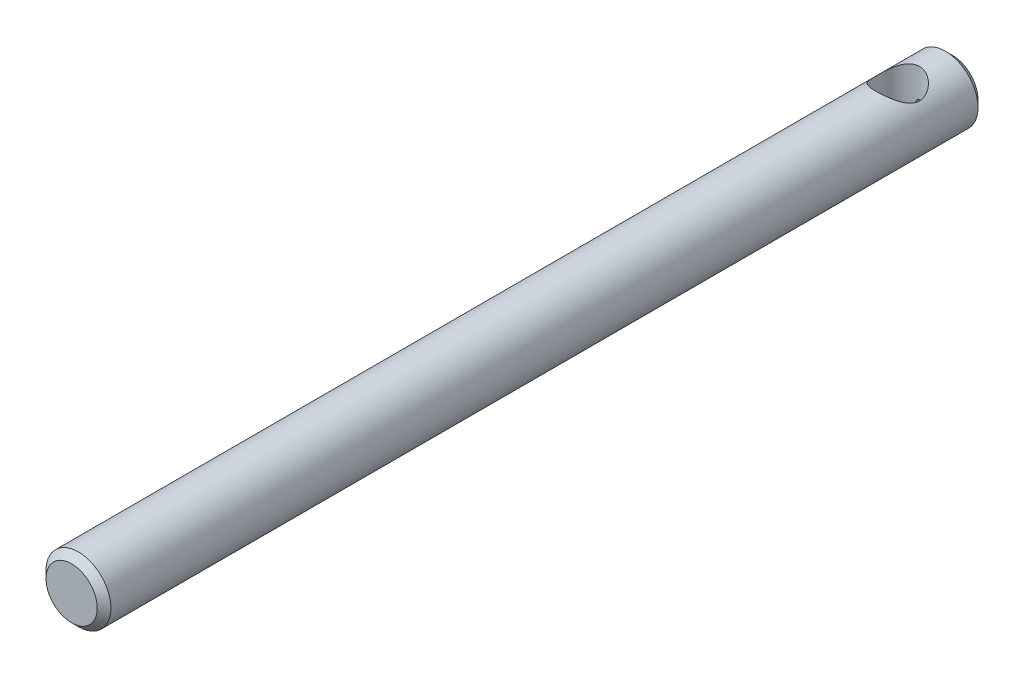
ISO-10303-21;
HEADER;
FILE_DESCRIPTION(('STEP AP214'),'2;1');
FILE_NAME('part.step','',(''),(''),'','','');
FILE_SCHEMA(('AUTOMOTIVE_DESIGN { 1 0 10303 214 1 1 1 1 }'));
ENDSEC;
DATA;
#1=APPLICATION_CONTEXT('core data for automotive mechanical design processes');
#2=APPLICATION_PROTOCOL_DEFINITION('international standard','automotive_design',2000,#1);
#3=PRODUCT_CONTEXT('',#1,'mechanical');
#4=PRODUCT('Part','Part','',(#3));
#5=PRODUCT_RELATED_PRODUCT_CATEGORY('part','',(#4));
#6=PRODUCT_DEFINITION_FORMATION('','',#4);
#7=PRODUCT_DEFINITION_CONTEXT('part definition',#1,'design');
#8=PRODUCT_DEFINITION('design','',#6,#7);
#9=PRODUCT_DEFINITION_SHAPE('','',#8);
#10=(LENGTH_UNIT() NAMED_UNIT(*) SI_UNIT(.MILLI.,.METRE.));
#11=(NAMED_UNIT(*) PLANE_ANGLE_UNIT() SI_UNIT($,.RADIAN.));
#12=(NAMED_UNIT(*) SI_UNIT($,.STERADIAN.) SOLID_ANGLE_UNIT());
#13=UNCERTAINTY_MEASURE_WITH_UNIT(LENGTH_MEASURE(1.E-05),#10,'distance_accuracy_value','');
#14=(GEOMETRIC_REPRESENTATION_CONTEXT(3) GLOBAL_UNCERTAINTY_ASSIGNED_CONTEXT((#13)) GLOBAL_UNIT_ASSIGNED_CONTEXT((#10,
#11,#12)) REPRESENTATION_CONTEXT('',''));
#15=CARTESIAN_POINT('',(0.,0.,0.));
#16=DIRECTION('',(0.,0.,1.));
#17=DIRECTION('',(1.,0.,0.));
#18=AXIS2_PLACEMENT_3D('',#15,#16,#17);
#19=CARTESIAN_POINT('',(9.02851192918774E-05,0.,121.000323623922));
#20=DIRECTION('',(0.,0.,-1.));
#21=DIRECTION('',(-1.,0.,0.));
#22=AXIS2_PLACEMENT_3D('',#19,#20,#21);
#23=PLANE('',#22);
#24=CARTESIAN_POINT('',(9.02851192916892E-05,0.,121.000323623922));
#25=DIRECTION('',(0.,0.,-1.));
#26=DIRECTION('',(-1.,0.,0.));
#27=AXIS2_PLACEMENT_3D('',#24,#25,#26);
#28=CIRCLE('',#27,3.75);
#29=CARTESIAN_POINT('',(-3.74990971488071,0.,121.000323623922));
#30=VERTEX_POINT('',#29);
#31=EDGE_CURVE('E9',#30,#30,#28,.F.);
#32=ORIENTED_EDGE('',*,*,#31,.T.);
#33=EDGE_LOOP('',(#32));
#34=FACE_BOUND('',#33,.T.);
#35=ADVANCED_FACE('F13',(#34),#23,.F.);
#36=CARTESIAN_POINT('',(9.02851192918774E-05,0.,-7.99967637607752));
#37=DIRECTION('',(0.,0.,-1.));
#38=DIRECTION('',(-1.,0.,0.));
#39=AXIS2_PLACEMENT_3D('',#36,#37,#38);
#40=CYLINDRICAL_SURFACE('',#39,4.75000000000001);
#41=CARTESIAN_POINT('',(9.02851192918774E-05,0.,120.000323623922));
#42=DIRECTION('',(0.,0.,-1.));
#43=DIRECTION('',(-1.,0.,0.));
#44=AXIS2_PLACEMENT_3D('',#41,#42,#43);
#45=CIRCLE('',#44,4.75000000000001);
#46=CARTESIAN_POINT('',(-4.74990971488072,0.,120.000323623922));
#47=VERTEX_POINT('',#46);
#48=EDGE_CURVE('E23',#47,#47,#45,.T.);
#49=ORIENTED_EDGE('',*,*,#48,.T.);
#50=EDGE_LOOP('',(#49));
#51=FACE_BOUND('',#50,.T.);
#52=CARTESIAN_POINT('',(9.02851192918774E-05,0.,-6.99967637607752));
#53=DIRECTION('',(0.,0.,1.));
#54=DIRECTION('',(1.,0.,0.));
#55=AXIS2_PLACEMENT_3D('',#52,#53,#54);
#56=CIRCLE('',#55,4.75000000000001);
#57=CARTESIAN_POINT('',(4.7500902851193,0.,-6.99967637607752));
#58=VERTEX_POINT('',#57);
#59=EDGE_CURVE('E30',#58,#58,#56,.T.);
#60=ORIENTED_EDGE('',*,*,#59,.T.);
#61=EDGE_LOOP('',(#60));
#62=FACE_BOUND('',#61,.T.);
#63=CARTESIAN_POINT('',(9.02851192932691E-05,-4.75000000000001,-3.17467637607752));
#64=CARTESIAN_POINT('',(0.159523559242158,-4.749999211952,-3.17467520210206));
#65=CARTESIAN_POINT('',(0.318960302784402,-4.74190338495527,-3.16260120587666));
#66=CARTESIAN_POINT('',(0.632738490097746,-4.71032455908102,-3.11505650051762));
#67=CARTESIAN_POINT('',(0.787077660661687,-4.68683479021578,-3.07957549734404));
#68=CARTESIAN_POINT('',(1.08567173449167,-4.62678353040751,-2.98739509817718));
#69=CARTESIAN_POINT('',(1.22997013682867,-4.59028324549489,-2.93079499645765));
#70=CARTESIAN_POINT('',(1.50643234848686,-4.50713889710792,-2.79879244895306));
#71=CARTESIAN_POINT('',(1.63859435592674,-4.46049333082322,-2.72338721734009));
#72=CARTESIAN_POINT('',(1.89972393961344,-4.35606566378104,-2.54893887313733));
#73=CARTESIAN_POINT('',(2.02746378167953,-4.29767380490287,-2.44843078013368));
#74=CARTESIAN_POINT('',(2.26543348465758,-4.17714675304667,-2.23014022595261));
#75=CARTESIAN_POINT('',(2.37563769541936,-4.11500625658128,-2.11233293575885));
#76=CARTESIAN_POINT('',(2.59329695211398,-3.98201923115985,-1.8410871244648));
#77=CARTESIAN_POINT('',(2.69753972413487,-3.91135622655066,-1.68496100416914));
#78=CARTESIAN_POINT('',(2.87819078591067,-3.78040838342273,-1.35342832264973));
#79=CARTESIAN_POINT('',(2.95464719541042,-3.72010569959833,-1.17805578449882));
#80=CARTESIAN_POINT('',(3.05819025467089,-3.63505890160726,-0.864237488175177));
#81=CARTESIAN_POINT('',(3.09316391185298,-3.60507428577889,-0.729828717145726));
#82=CARTESIAN_POINT('',(3.14532023822978,-3.5596705342505,-0.455301698493249));
#83=CARTESIAN_POINT('',(3.16253381858021,-3.54422609569885,-0.315193813526074));
#84=CARTESIAN_POINT('',(3.17808703884019,-3.53029276704611,-0.0324651157176194));
#85=CARTESIAN_POINT('',(3.17634813940645,-3.53187443302817,0.110163706802345));
#86=CARTESIAN_POINT('',(3.15393566336046,-3.55189525709392,0.392771423106469));
#87=CARTESIAN_POINT('',(3.13324604040797,-3.57034870116703,0.532747968563199));
#88=CARTESIAN_POINT('',(3.07564590349141,-3.62005530602343,0.799980106674125));
#89=CARTESIAN_POINT('',(3.03951005067753,-3.65069285254148,0.927524705505058));
#90=CARTESIAN_POINT('',(2.95277435532785,-3.72119236198158,1.17483413862681));
#91=CARTESIAN_POINT('',(2.90216974706534,-3.76105736342256,1.29459639358712));
#92=CARTESIAN_POINT('',(2.7761289041144,-3.85531840590746,1.54896641476868));
#93=CARTESIAN_POINT('',(2.69773308512173,-3.91101980105383,1.68161950145604));
#94=CARTESIAN_POINT('',(2.52342108076777,-4.02569455529003,1.93343430626161));
#95=CARTESIAN_POINT('',(2.42748325676911,-4.08467189210462,2.05257906405419));
#96=CARTESIAN_POINT('',(2.19642000339969,-4.21423522790872,2.30063028524261));
#97=CARTESIAN_POINT('',(2.05731066722869,-4.28455099643896,2.42600830864916));
#98=CARTESIAN_POINT('',(1.75653079691954,-4.41636796090386,2.6518912235589));
#99=CARTESIAN_POINT('',(1.5948813364133,-4.47787728269224,2.75241910775619));
#100=CARTESIAN_POINT('',(1.28564463734124,-4.57501369248633,2.90751416849579));
#101=CARTESIAN_POINT('',(1.14149287685756,-4.61335009150547,2.96722532162));
#102=CARTESIAN_POINT('',(0.843386465308846,-4.67701970125944,3.06529318383422));
#103=CARTESIAN_POINT('',(0.689440241994157,-4.70236392560248,3.10366798232764));
#104=CARTESIAN_POINT('',(0.375084826086689,-4.73782521946594,3.1571446896905));
#105=CARTESIAN_POINT('',(0.214650400178247,-4.74787547344105,3.17214448581729));
#106=CARTESIAN_POINT('',(-0.106828979534429,-4.75151468856562,3.17759036966522));
#107=CARTESIAN_POINT('',(-0.267873883393648,-4.74510496852045,3.16803842451994));
#108=CARTESIAN_POINT('',(-0.573853185577953,-4.71752224658637,3.12655964674889));
#109=CARTESIAN_POINT('',(-0.719116672692495,-4.69743647642483,3.09627976832538));
#110=CARTESIAN_POINT('',(-1.00201012973531,-4.64532012613918,3.01661755079842));
#111=CARTESIAN_POINT('',(-1.13963888084322,-4.61328764509262,2.96723217164209));
#112=CARTESIAN_POINT('',(-1.41255154854837,-4.53742110448774,2.84787791279913));
#113=CARTESIAN_POINT('',(-1.54720800294586,-4.49299795354843,2.77685859836752));
#114=CARTESIAN_POINT('',(-1.80313132638656,-4.39654739148957,2.61790733926099));
#115=CARTESIAN_POINT('',(-1.92439000476669,-4.34451537339169,2.5299651379384));
#116=CARTESIAN_POINT('',(-2.17038032744309,-4.22763553546742,2.32397328277039));
#117=CARTESIAN_POINT('',(-2.29262226184674,-4.1620629302639,2.20336129660345));
#118=CARTESIAN_POINT('',(-2.51624769765088,-4.03080183178884,1.94403564657291));
#119=CARTESIAN_POINT('',(-2.61761618483209,-3.96511328913999,1.80530906932388));
#120=CARTESIAN_POINT('',(-2.79046195891875,-3.84518858129252,1.52301454245801));
#121=CARTESIAN_POINT('',(-2.86368776855465,-3.79045623144052,1.3807336538721));
#122=CARTESIAN_POINT('',(-2.9887997924519,-3.69260969367759,1.08340219409397));
#123=CARTESIAN_POINT('',(-3.04072435688301,-3.64947467495308,0.928375180341632));
#124=CARTESIAN_POINT('',(-3.11320542231531,-3.58772145394521,0.637628617305611));
#125=CARTESIAN_POINT('',(-3.13776387372683,-3.5660608723218,0.503569005525376));
#126=CARTESIAN_POINT('',(-3.16939765693855,-3.53798273381451,0.231881429631234));
#127=CARTESIAN_POINT('',(-3.17649256806744,-3.531548106595,0.0942576366831156));
#128=CARTESIAN_POINT('',(-3.17273051584376,-3.53492719799126,-0.180634826070279));
#129=CARTESIAN_POINT('',(-3.16186019110862,-3.54475301007916,-0.317903155444917));
#130=CARTESIAN_POINT('',(-3.12289454000202,-3.57912150992849,-0.588140498755023));
#131=CARTESIAN_POINT('',(-3.09477618948109,-3.60368386833828,-0.72110351539677));
#132=CARTESIAN_POINT('',(-3.01331764295638,-3.6722439182131,-1.01397363602656));
#133=CARTESIAN_POINT('',(-2.95528647282194,-3.71965573890371,-1.17175960379719));
#134=CARTESIAN_POINT('',(-2.81709952797029,-3.82537408900602,-1.47333981552594));
#135=CARTESIAN_POINT('',(-2.73691260311399,-3.88369591990883,-1.61711397156006));
#136=CARTESIAN_POINT('',(-2.55487832198092,-4.00585681478387,-1.89187504908151));
#137=CARTESIAN_POINT('',(-2.4526585388334,-4.06977783459629,-2.02257702012106));
#138=CARTESIAN_POINT('',(-2.22875950283445,-4.19657773635319,-2.26689629211049));
#139=CARTESIAN_POINT('',(-2.10707422092758,-4.25945628873275,-2.38050827854991));
#140=CARTESIAN_POINT('',(-1.90129614987098,-4.35362786266907,-2.54419312911521));
#141=CARTESIAN_POINT('',(-1.82321620891763,-4.38698389120322,-2.60074380981563));
#142=CARTESIAN_POINT('',(-1.66140918884278,-4.45078321221234,-2.70696343033902));
#143=CARTESIAN_POINT('',(-1.57768470210049,-4.48122782648757,-2.75663549772936));
#144=CARTESIAN_POINT('',(-1.40506883584378,-4.53831230344027,-2.8484825138305));
#145=CARTESIAN_POINT('',(-1.31618196834517,-4.56495542032589,-2.89066388248807));
#146=CARTESIAN_POINT('',(-1.13384136679606,-4.6136338401226,-2.96693099632058));
#147=CARTESIAN_POINT('',(-1.04038917896523,-4.63567068995518,-3.00101945985767));
#148=CARTESIAN_POINT('',(-0.794122920593584,-4.68565064367691,-3.07778419214154));
#149=CARTESIAN_POINT('',(-0.638360227857761,-4.70958857412386,-3.11394630589047));
#150=CARTESIAN_POINT('',(-0.321699908452763,-4.74175724534122,-3.16238325014652));
#151=CARTESIAN_POINT('',(-0.160806578371704,-4.75000079528226,-3.17467756083));
#152=CARTESIAN_POINT('',(9.02851192932691E-05,-4.75000000000001,-3.17467637607752));
#153=B_SPLINE_CURVE_WITH_KNOTS('',3,(#63,#64,#65,#66,#67,#68,#69,#70,#71,#72,#73,#74,#75,#76,
#77,#78,#79,#80,#81,#82,#83,#84,#85,#86,#87,#88,#89,#90,#91,#92,#93,#94,#95,#96,#97,#98,#99,
#100,#101,#102,#103,#104,#105,#106,#107,#108,#109,#110,#111,#112,#113,#114,#115,#116,#117,#118,
#119,#120,#121,#122,#123,#124,#125,#126,#127,#128,#129,#130,#131,#132,#133,#134,#135,#136,#137,
#138,#139,#140,#141,#142,#143,#144,#145,#146,#147,#148,#149,#150,#151,#152),.UNSPECIFIED.,.T.,
.F.,(4,2,2,2,2,2,2,2,2,2,2,2,2,2,2,2,2,2,2,2,2,2,2,2,2,2,2,2,2,2,2,2,2,2,2,2,2,2,2,2,2,2,2,2,4),
(0.,0.477670324353115,0.955550860900732,1.4312123232046,1.9069442928089,2.42313825950044,
2.94008047950573,3.53906707979407,4.13701137033099,4.56158021920458,4.98540885918278,
5.41099451655657,5.83694086789796,6.2436531122531,6.65049947434567,7.1403321818873,
7.63077324109545,8.228063650625,8.82479932860172,9.30479598936381,9.78438507604036,
10.26606341294,10.7477031580314,11.1949397894877,11.6422476141891,12.1161870778625,
12.5904146973429,13.1397243978878,13.6894278458804,14.1949135991591,14.6994852531897,
15.1117000268718,15.523452433123,15.9355112120628,16.3481212431652,16.869348520834,
17.3913123860669,17.9229089335254,18.454670452504,18.7603505360058,19.0658911733362,
19.3711686680123,19.6763434761234,20.1587927160615,20.6408480297592),.UNSPECIFIED.);
#154=CARTESIAN_POINT('',(9.02851192932691E-05,-4.75000000000001,-3.17467637607752));
#155=VERTEX_POINT('',#154);
#156=EDGE_CURVE('E36',#155,#155,#153,.F.);
#157=ORIENTED_EDGE('',*,*,#156,.T.);
#158=EDGE_LOOP('',(#157));
#159=FACE_BOUND('',#158,.T.);
#160=CARTESIAN_POINT('',(9.02851192899962E-05,4.75000000000001,-3.17467637607752));
#161=CARTESIAN_POINT('',(-0.159342989003575,4.749999211952,-3.17467520210206));
#162=CARTESIAN_POINT('',(-0.318779732545819,4.74190338495527,-3.16260120587666));
#163=CARTESIAN_POINT('',(-0.632557919859163,4.71032455908102,-3.11505650051762));
#164=CARTESIAN_POINT('',(-0.786897090423105,4.68683479021578,-3.07957549734404));
#165=CARTESIAN_POINT('',(-1.08549116425309,4.62678353040751,-2.98739509817718));
#166=CARTESIAN_POINT('',(-1.22978956659008,4.59028324549489,-2.93079499645765));
#167=CARTESIAN_POINT('',(-1.50625177824828,4.50713889710792,-2.79879244895306));
#168=CARTESIAN_POINT('',(-1.63841378568815,4.46049333082322,-2.72338721734009));
#169=CARTESIAN_POINT('',(-1.89954336937486,4.35606566378104,-2.54893887313733));
#170=CARTESIAN_POINT('',(-2.02728321144095,4.29767380490287,-2.44843078013367));
#171=CARTESIAN_POINT('',(-2.26525291441899,4.17714675304667,-2.23014022595261));
#172=CARTESIAN_POINT('',(-2.37545712518077,4.11500625658128,-2.11233293575884));
#173=CARTESIAN_POINT('',(-2.5931163818754,3.98201923115984,-1.84108712446479));
#174=CARTESIAN_POINT('',(-2.69735915389629,3.91135622655066,-1.68496100416914));
#175=CARTESIAN_POINT('',(-2.87801021567209,3.78040838342273,-1.35342832264973));
#176=CARTESIAN_POINT('',(-2.95446662517184,3.72010569959833,-1.17805578449882));
#177=CARTESIAN_POINT('',(-3.05800968443231,3.63505890160726,-0.864237488175176));
#178=CARTESIAN_POINT('',(-3.0929833416144,3.60507428577888,-0.729828717145725));
#179=CARTESIAN_POINT('',(-3.14513966799119,3.5596705342505,-0.455301698493248));
#180=CARTESIAN_POINT('',(-3.16235324834162,3.54422609569885,-0.315193813526073));
#181=CARTESIAN_POINT('',(-3.17790646860161,3.53029276704611,-0.0324651157176186));
#182=CARTESIAN_POINT('',(-3.17616756916787,3.53187443302817,0.110163706802346));
#183=CARTESIAN_POINT('',(-3.15375509312187,3.55189525709392,0.392771423106469));
#184=CARTESIAN_POINT('',(-3.13306547016938,3.57034870116703,0.5327479685632));
#185=CARTESIAN_POINT('',(-3.07546533325283,3.62005530602343,0.799980106674125));
#186=CARTESIAN_POINT('',(-3.03932948043895,3.65069285254148,0.927524705505058));
#187=CARTESIAN_POINT('',(-2.95259378508926,3.72119236198158,1.17483413862681));
#188=CARTESIAN_POINT('',(-2.90198917682676,3.76105736342256,1.29459639358712));
#189=CARTESIAN_POINT('',(-2.77594833387582,3.85531840590746,1.54896641476868));
#190=CARTESIAN_POINT('',(-2.69755251488315,3.91101980105383,1.68161950145604));
#191=CARTESIAN_POINT('',(-2.52324051052919,4.02569455529003,1.93343430626161));
#192=CARTESIAN_POINT('',(-2.42730268653052,4.08467189210461,2.05257906405419));
#193=CARTESIAN_POINT('',(-2.19623943316111,4.21423522790872,2.30063028524261));
#194=CARTESIAN_POINT('',(-2.0571300969901,4.28455099643896,2.42600830864916));
#195=CARTESIAN_POINT('',(-1.75635022668096,4.41636796090385,2.6518912235589));
#196=CARTESIAN_POINT('',(-1.59470076617472,4.47787728269224,2.75241910775619));
#197=CARTESIAN_POINT('',(-1.28546406710265,4.57501369248633,2.90751416849579));
#198=CARTESIAN_POINT('',(-1.14131230661897,4.61335009150547,2.96722532162));
#199=CARTESIAN_POINT('',(-0.843205895070263,4.67701970125944,3.06529318383422));
#200=CARTESIAN_POINT('',(-0.689259671755574,4.70236392560248,3.10366798232764));
#201=CARTESIAN_POINT('',(-0.374904255848105,4.73782521946594,3.1571446896905));
#202=CARTESIAN_POINT('',(-0.214469829939662,4.74787547344105,3.17214448581729));
#203=CARTESIAN_POINT('',(0.107009549773013,4.75151468856562,3.17759036966522));
#204=CARTESIAN_POINT('',(0.268054453632232,4.74510496852045,3.16803842451994));
#205=CARTESIAN_POINT('',(0.574033755816537,4.71752224658637,3.12655964674889));
#206=CARTESIAN_POINT('',(0.719297242931079,4.69743647642483,3.09627976832538));
#207=CARTESIAN_POINT('',(1.0021906999739,4.64532012613918,3.01661755079842));
#208=CARTESIAN_POINT('',(1.13981945108181,4.61328764509262,2.96723217164209));
#209=CARTESIAN_POINT('',(1.41273211878696,4.53742110448774,2.84787791279913));
#210=CARTESIAN_POINT('',(1.54738857318445,4.49299795354843,2.77685859836752));
#211=CARTESIAN_POINT('',(1.80331189662514,4.39654739148957,2.61790733926099));
#212=CARTESIAN_POINT('',(1.92457057500528,4.34451537339169,2.5299651379384));
#213=CARTESIAN_POINT('',(2.17056089768168,4.22763553546743,2.32397328277039));
#214=CARTESIAN_POINT('',(2.29280283208533,4.1620629302639,2.20336129660345));
#215=CARTESIAN_POINT('',(2.51642826788946,4.03080183178884,1.94403564657291));
#216=CARTESIAN_POINT('',(2.61779675507067,3.96511328914,1.80530906932388));
#217=CARTESIAN_POINT('',(2.79064252915733,3.84518858129252,1.52301454245801));
#218=CARTESIAN_POINT('',(2.86386833879323,3.79045623144052,1.3807336538721));
#219=CARTESIAN_POINT('',(2.98898036269048,3.69260969367759,1.08340219409397));
#220=CARTESIAN_POINT('',(3.04090492712159,3.64947467495308,0.928375180341631));
#221=CARTESIAN_POINT('',(3.11338599255389,3.58772145394521,0.637628617305609));
#222=CARTESIAN_POINT('',(3.13794444396541,3.5660608723218,0.503569005525375));
#223=CARTESIAN_POINT('',(3.16957822717713,3.53798273381451,0.231881429631233));
#224=CARTESIAN_POINT('',(3.17667313830602,3.531548106595,0.0942576366831144));
#225=CARTESIAN_POINT('',(3.17291108608234,3.53492719799126,-0.180634826070281));
#226=CARTESIAN_POINT('',(3.1620407613472,3.54475301007916,-0.317903155444918));
#227=CARTESIAN_POINT('',(3.1230751102406,3.57912150992849,-0.588140498755025));
#228=CARTESIAN_POINT('',(3.09495675971967,3.60368386833828,-0.721103515396771));
#229=CARTESIAN_POINT('',(3.01349821319496,3.6722439182131,-1.01397363602656));
#230=CARTESIAN_POINT('',(2.95546704306052,3.71965573890371,-1.17175960379719));
#231=CARTESIAN_POINT('',(2.81728009820887,3.82537408900602,-1.47333981552595));
#232=CARTESIAN_POINT('',(2.73709317335258,3.88369591990883,-1.61711397156006));
#233=CARTESIAN_POINT('',(2.5550588922195,4.00585681478387,-1.89187504908151));
#234=CARTESIAN_POINT('',(2.45283910907198,4.06977783459629,-2.02257702012106));
#235=CARTESIAN_POINT('',(2.22894007307303,4.19657773635319,-2.26689629211049));
#236=CARTESIAN_POINT('',(2.10725479116616,4.25945628873275,-2.38050827854991));
#237=CARTESIAN_POINT('',(1.90147672010956,4.35362786266907,-2.54419312911521));
#238=CARTESIAN_POINT('',(1.82339677915621,4.38698389120322,-2.60074380981564));
#239=CARTESIAN_POINT('',(1.66158975908136,4.45078321221234,-2.70696343033902));
#240=CARTESIAN_POINT('',(1.57786527233907,4.48122782648757,-2.75663549772936));
#241=CARTESIAN_POINT('',(1.40524940608236,4.53831230344027,-2.8484825138305));
#242=CARTESIAN_POINT('',(1.31636253858375,4.56495542032589,-2.89066388248807));
#243=CARTESIAN_POINT('',(1.13402193703464,4.61363384012261,-2.96693099632058));
#244=CARTESIAN_POINT('',(1.04056974920381,4.63567068995518,-3.00101945985767));
#245=CARTESIAN_POINT('',(0.794303490832166,4.6856506436769,-3.07778419214154));
#246=CARTESIAN_POINT('',(0.638540798096343,4.70958857412386,-3.11394630589047));
#247=CARTESIAN_POINT('',(0.321880478691345,4.74175724534122,-3.16238325014652));
#248=CARTESIAN_POINT('',(0.160987148610287,4.75000079528226,-3.17467756083));
#249=CARTESIAN_POINT('',(9.02851192899962E-05,4.75000000000001,-3.17467637607752));
#250=B_SPLINE_CURVE_WITH_KNOTS('',3,(#160,#161,#162,#163,#164,#165,#166,#167,#168,#169,#170,
#171,#172,#173,#174,#175,#176,#177,#178,#179,#180,#181,#182,#183,#184,#185,#186,#187,#188,#189,
#190,#191,#192,#193,#194,#195,#196,#197,#198,#199,#200,#201,#202,#203,#204,#205,#206,#207,#208,
#209,#210,#211,#212,#213,#214,#215,#216,#217,#218,#219,#220,#221,#222,#223,#224,#225,#226,#227,
#228,#229,#230,#231,#232,#233,#234,#235,#236,#237,#238,#239,#240,#241,#242,#243,#244,#245,#246,
#247,#248,#249),.UNSPECIFIED.,.T.,.F.,(4,2,2,2,2,2,2,2,2,2,2,2,2,2,2,2,2,2,2,2,2,2,2,2,2,2,2,2,
2,2,2,2,2,2,2,2,2,2,2,2,2,2,2,2,4),(0.,0.477670324353115,0.955550860900732,1.43121232320461,
1.9069442928089,2.42313825950044,2.94008047950573,3.53906707979407,4.13701137033099,
4.56158021920458,4.98540885918278,5.41099451655657,5.83694086789796,6.2436531122531,
6.65049947434567,7.1403321818873,7.63077324109545,8.228063650625,8.82479932860172,
9.30479598936381,9.78438507604036,10.26606341294,10.7477031580315,11.1949397894877,
11.6422476141891,12.1161870778625,12.5904146973429,13.1397243978878,13.6894278458804,
14.1949135991591,14.6994852531897,15.1117000268718,15.523452433123,15.9355112120629,
16.3481212431652,16.869348520834,17.3913123860669,17.9229089335254,18.454670452504,
18.7603505360058,19.0658911733362,19.3711686680123,19.6763434761234,20.1587927160615,
20.6408480297592),.UNSPECIFIED.);
#251=CARTESIAN_POINT('',(9.02851192899962E-05,4.75000000000001,-3.17467637607752));
#252=VERTEX_POINT('',#251);
#253=EDGE_CURVE('E43',#252,#252,#250,.F.);
#254=ORIENTED_EDGE('',*,*,#253,.T.);
#255=EDGE_LOOP('',(#254));
#256=FACE_BOUND('',#255,.T.);
#257=ADVANCED_FACE('F48',(#51,#62,#159,#256),#40,.T.);
#258=CARTESIAN_POINT('',(9.02851192918774E-05,0.,-7.99967637607752));
#259=DIRECTION('',(0.,0.,1.));
#260=DIRECTION('',(1.,0.,0.));
#261=AXIS2_PLACEMENT_3D('',#258,#259,#260);
#262=PLANE('',#261);
#263=CARTESIAN_POINT('',(9.02851192922809E-05,0.,-7.99967637607752));
#264=DIRECTION('',(0.,0.,1.));
#265=DIRECTION('',(1.,0.,0.));
#266=AXIS2_PLACEMENT_3D('',#263,#264,#265);
#267=CIRCLE('',#266,3.75);
#268=CARTESIAN_POINT('',(3.7500902851193,0.,-7.99967637607752));
#269=VERTEX_POINT('',#268);
#270=EDGE_CURVE('E69',#269,#269,#267,.F.);
#271=ORIENTED_EDGE('',*,*,#270,.T.);
#272=EDGE_LOOP('',(#271));
#273=FACE_BOUND('',#272,.T.);
#274=CARTESIAN_POINT('',(9.02851192904166E-05,0.,-7.99967637607752));
#275=DIRECTION('',(0.,0.,1.));
#276=DIRECTION('',(1.,0.,0.));
#277=AXIS2_PLACEMENT_3D('',#274,#275,#276);
#278=CIRCLE('',#277,0.499999999999999);
#279=CARTESIAN_POINT('',(0.500090285119289,0.,-7.99967637607752));
#280=VERTEX_POINT('',#279);
#281=EDGE_CURVE('E18',#280,#280,#278,.F.);
#282=ORIENTED_EDGE('',*,*,#281,.F.);
#283=EDGE_LOOP('',(#282));
#284=FACE_BOUND('',#283,.T.);
#285=ADVANCED_FACE('F52',(#273,#284),#262,.F.);
#286=CARTESIAN_POINT('',(9.02851192918774E-05,-10.,0.000323623922480754));
#287=DIRECTION('',(0.,1.,0.));
#288=DIRECTION('',(1.,0.,0.));
#289=AXIS2_PLACEMENT_3D('',#286,#287,#288);
#290=CYLINDRICAL_SURFACE('',#289,3.175);
#291=CARTESIAN_POINT('',(0.50009028511929,0.,-3.13505912783208));
#292=CARTESIAN_POINT('',(0.500089145833202,0.027897747805815,-3.1350596117128));
#293=CARTESIAN_POINT('',(0.497747531507359,0.0558112720045634,-3.13543549918252));
#294=CARTESIAN_POINT('',(0.488446119696019,0.110856680252458,-3.13689726333182));
#295=CARTESIAN_POINT('',(0.481481924847439,0.137987794343761,-3.13798381603781));
#296=CARTESIAN_POINT('',(0.463149909841214,0.190663707890317,-3.14074086410108));
#297=CARTESIAN_POINT('',(0.451785600226606,0.216209753156556,-3.14241089383949));
#298=CARTESIAN_POINT('',(0.424984427778004,0.26502919216806,-3.146146173875));
#299=CARTESIAN_POINT('',(0.409548080818352,0.288302873281044,-3.14821137410003));
#300=CARTESIAN_POINT('',(0.374895815840152,0.332125270916456,-3.15252464207061));
#301=CARTESIAN_POINT('',(0.355651059123807,0.352651057147097,-3.15477402317795));
#302=CARTESIAN_POINT('',(0.313990560833302,0.39019610271537,-3.15919050669613));
#303=CARTESIAN_POINT('',(0.291574639196031,0.40721516280137,-3.16135760442594));
#304=CARTESIAN_POINT('',(0.244060464438045,0.437348904555735,-3.16537916082933));
#305=CARTESIAN_POINT('',(0.218948597539818,0.450442369693115,-3.16723189792344));
#306=CARTESIAN_POINT('',(0.166847962246803,0.472216997906316,-3.17040140252456));
#307=CARTESIAN_POINT('',(0.139859303069834,0.480898417492307,-3.1717182011894));
#308=CARTESIAN_POINT('',(0.0850076949462363,0.493532731277547,-3.17365819311014));
#309=CARTESIAN_POINT('',(0.0571538070275657,0.497524083917402,-3.17428702469853));
#310=CARTESIAN_POINT('',(0.00116504316753877,0.50078445577113,-3.17479957545666));
#311=CARTESIAN_POINT('',(-0.0269698155302474,0.500053763026787,-3.17468334007501));
#312=CARTESIAN_POINT('',(-0.0824592432142669,0.493920979639827,-3.17372334028038));
#313=CARTESIAN_POINT('',(-0.109818513084364,0.488560270058137,-3.1728860207934));
#314=CARTESIAN_POINT('',(-0.163244279329589,0.47338466847541,-3.17058511494218));
#315=CARTESIAN_POINT('',(-0.189310739690839,0.463569652467692,-3.16912151114241));
#316=CARTESIAN_POINT('',(-0.239535252148086,0.439722228683038,-3.16572145294849));
#317=CARTESIAN_POINT('',(-0.263684973405082,0.425672561727835,-3.16378306966968));
#318=CARTESIAN_POINT('',(-0.309299664202075,0.39376727409443,-3.15964919217598));
#319=CARTESIAN_POINT('',(-0.330764439093165,0.375911377731811,-3.15745367934244));
#320=CARTESIAN_POINT('',(-0.370644108418344,0.336670406613413,-3.15302201367702));
#321=CARTESIAN_POINT('',(-0.389023432747962,0.315249185200977,-3.15078567826722));
#322=CARTESIAN_POINT('',(-0.421932284111327,0.269607997154783,-3.14654753784162));
#323=CARTESIAN_POINT('',(-0.436461782604719,0.245388009774524,-3.14454573456456));
#324=CARTESIAN_POINT('',(-0.461264298868797,0.19479791154871,-3.14100329565925));
#325=CARTESIAN_POINT('',(-0.471533387655421,0.168425842733444,-3.13946308607813));
#326=CARTESIAN_POINT('',(-0.487486350934631,0.114301530482119,-3.13702553915117));
#327=CARTESIAN_POINT('',(-0.49317058346396,0.0865493949967901,-3.13612815160722));
#328=CARTESIAN_POINT('',(-0.499743128774804,0.0307699814969835,-3.1350874612829));
#329=CARTESIAN_POINT('',(-0.500681987651473,0.00274880265876212,-3.13493621131848));
#330=CARTESIAN_POINT('',(-0.497871508042097,-0.0530505476560027,-3.13538379218504));
#331=CARTESIAN_POINT('',(-0.494122330474021,-0.0808287274405895,-3.13598259727021));
#332=CARTESIAN_POINT('',(-0.482085172708255,-0.135195236964945,-3.1378554992759));
#333=CARTESIAN_POINT('',(-0.473822612834468,-0.161789336750234,-3.13912581283731));
#334=CARTESIAN_POINT('',(-0.453019771734351,-0.213215251584011,-3.14219545580756));
#335=CARTESIAN_POINT('',(-0.440479259566662,-0.238046971404577,-3.14399481377568));
#336=CARTESIAN_POINT('',(-0.411355988177574,-0.285469120577579,-3.14793841440081));
#337=CARTESIAN_POINT('',(-0.39474065225451,-0.308039312686301,-3.15008538660182));
#338=CARTESIAN_POINT('',(-0.357984417111327,-0.350089168587145,-3.15447418992945));
#339=CARTESIAN_POINT('',(-0.337843297432783,-0.369568638978897,-3.15671602698107));
#340=CARTESIAN_POINT('',(-0.294384037108894,-0.405066957111748,-3.16106693094057));
#341=CARTESIAN_POINT('',(-0.271038296258083,-0.421052214439132,-3.16317458187673));
#342=CARTESIAN_POINT('',(-0.221963434814379,-0.448873769583761,-3.16699732880518));
#343=CARTESIAN_POINT('',(-0.19623438477557,-0.460710190171133,-3.16871243641288));
#344=CARTESIAN_POINT('',(-0.143225907483084,-0.479845017010301,-3.17155066842472));
#345=CARTESIAN_POINT('',(-0.115953116477548,-0.487161444303349,-3.17267614091585));
#346=CARTESIAN_POINT('',(-0.0605469006439216,-0.497106796609062,-3.17421818023858));
#347=CARTESIAN_POINT('',(-0.0324135388850886,-0.499736064299704,-3.17463479889434));
#348=CARTESIAN_POINT('',(0.0235901218126674,-0.500223444488451,-3.17471157666607));
#349=CARTESIAN_POINT('',(0.0514599768837873,-0.498132826228016,-3.17437986447277));
#350=CARTESIAN_POINT('',(0.106446472623592,-0.489350108819024,-3.17301373089045));
#351=CARTESIAN_POINT('',(0.13356311645305,-0.482658028983058,-3.17197931245074));
#352=CARTESIAN_POINT('',(0.186256958989604,-0.464881198267335,-3.1693235014875));
#353=CARTESIAN_POINT('',(0.211835503096172,-0.45380035263247,-3.16770263091586));
#354=CARTESIAN_POINT('',(0.260778315020562,-0.4275661014077,-3.16405146880434));
#355=CARTESIAN_POINT('',(0.284142496280462,-0.412412536706744,-3.16202116126954));
#356=CARTESIAN_POINT('',(0.32825264632251,-0.378279185039425,-3.15775035745026));
#357=CARTESIAN_POINT('',(0.348969238111394,-0.359261674216167,-3.15550791538305));
#358=CARTESIAN_POINT('',(0.38693551413504,-0.318019602668411,-3.15107956591478));
#359=CARTESIAN_POINT('',(0.404184384677171,-0.295794291337934,-3.14889367188718));
#360=CARTESIAN_POINT('',(0.434823323159357,-0.248603602152167,-3.14481123532368));
#361=CARTESIAN_POINT('',(0.448188632278798,-0.223621986687504,-3.14291658409673));
#362=CARTESIAN_POINT('',(0.470513191787509,-0.171749621791646,-3.13965339414929));
#363=CARTESIAN_POINT('',(0.479476940416415,-0.144860853710234,-3.13828431862262));
#364=CARTESIAN_POINT('',(0.490747659702385,-0.0982151273970526,-3.13653809372817));
#365=CARTESIAN_POINT('',(0.494245671187799,-0.0787438899730604,-3.13598648405512));
#366=CARTESIAN_POINT('',(0.498917369881661,-0.0395177378824662,-3.13524683246128));
#367=CARTESIAN_POINT('',(0.500091092192126,-0.0197628275045051,-3.13505878504988));
#368=CARTESIAN_POINT('',(0.50009028511929,0.,-3.13505912783208));
#369=B_SPLINE_CURVE_WITH_KNOTS('',3,(#291,#292,#293,#294,#295,#296,#297,#298,#299,#300,#301,
#302,#303,#304,#305,#306,#307,#308,#309,#310,#311,#312,#313,#314,#315,#316,#317,#318,#319,#320,
#321,#322,#323,#324,#325,#326,#327,#328,#329,#330,#331,#332,#333,#334,#335,#336,#337,#338,#339,
#340,#341,#342,#343,#344,#345,#346,#347,#348,#349,#350,#351,#352,#353,#354,#355,#356,#357,#358,
#359,#360,#361,#362,#363,#364,#365,#366,#367,#368),.UNSPECIFIED.,.T.,.F.,(4,2,2,2,2,2,2,2,2,2,2,
2,2,2,2,2,2,2,2,2,2,2,2,2,2,2,2,2,2,2,2,2,2,2,2,2,2,2,4),(0.,0.0836209936366758,
0.167321648378127,0.250955661383983,0.334579084128773,0.418861794970134,0.503149293422136,
0.587884449490837,0.672614678612135,0.756645162932655,0.840670521495114,0.923952579230432,
1.00723695565785,1.0908654730232,1.17450004964432,1.25904091979536,1.34358241666537,
1.4282017060033,1.51281438668283,1.5965238740195,1.68023048808693,1.76347043828418,
1.84671488282564,1.93064786747276,2.01458610211497,2.09929885274597,2.18400909639149,
2.26837938628596,2.35274350762025,2.43619564743796,2.51964743700452,2.60302513509925,
2.6864060910278,2.77064400619486,2.85490166457911,2.93968526163601,3.02438203157551,
3.08362022681867,3.14285752742444),.UNSPECIFIED.);
#370=CARTESIAN_POINT('',(0.50009028511929,0.,-3.13505912783208));
#371=VERTEX_POINT('',#370);
#372=EDGE_CURVE('E63',#371,#371,#369,.F.);
#373=ORIENTED_EDGE('',*,*,#372,.T.);
#374=EDGE_LOOP('',(#373));
#375=FACE_BOUND('',#374,.T.);
#376=ORIENTED_EDGE('',*,*,#253,.F.);
#377=EDGE_LOOP('',(#376));
#378=FACE_BOUND('',#377,.T.);
#379=ORIENTED_EDGE('',*,*,#156,.F.);
#380=EDGE_LOOP('',(#379));
#381=FACE_BOUND('',#380,.T.);
#382=ADVANCED_FACE('F15',(#375,#378,#381),#290,.F.);
#383=CARTESIAN_POINT('',(9.02851192918774E-05,0.,-7.99967637607752));
#384=DIRECTION('',(0.,0.,1.));
#385=DIRECTION('',(1.,0.,0.));
#386=AXIS2_PLACEMENT_3D('',#383,#384,#385);
#387=CONICAL_SURFACE('',#386,3.75,0.785398163397452);
#388=ORIENTED_EDGE('',*,*,#59,.F.);
#389=EDGE_LOOP('',(#388));
#390=FACE_BOUND('',#389,.T.);
#391=ORIENTED_EDGE('',*,*,#270,.F.);
#392=EDGE_LOOP('',(#391));
#393=FACE_BOUND('',#392,.T.);
#394=ADVANCED_FACE('F61',(#390,#393),#387,.T.);
#395=CARTESIAN_POINT('',(9.02851192918774E-05,0.,120.000323623922));
#396=DIRECTION('',(0.,0.,-1.));
#397=DIRECTION('',(0.,-1.,0.));
#398=AXIS2_PLACEMENT_3D('',#395,#396,#397);
#399=CONICAL_SURFACE('',#398,4.75000000000001,0.785398163397452);
#400=ORIENTED_EDGE('',*,*,#31,.F.);
#401=EDGE_LOOP('',(#400));
#402=FACE_BOUND('',#401,.T.);
#403=ORIENTED_EDGE('',*,*,#48,.F.);
#404=EDGE_LOOP('',(#403));
#405=FACE_BOUND('',#404,.T.);
#406=ADVANCED_FACE('F59',(#402,#405),#399,.T.);
#407=CARTESIAN_POINT('',(9.02851192918774E-05,0.,2.00032362392249));
#408=DIRECTION('',(0.,0.,-1.));
#409=DIRECTION('',(-1.,0.,0.));
#410=AXIS2_PLACEMENT_3D('',#407,#408,#409);
#411=CYLINDRICAL_SURFACE('',#410,0.499999999999999);
#412=ORIENTED_EDGE('',*,*,#281,.T.);
#413=EDGE_LOOP('',(#412));
#414=FACE_BOUND('',#413,.T.);
#415=ORIENTED_EDGE('',*,*,#372,.F.);
#416=EDGE_LOOP('',(#415));
#417=FACE_BOUND('',#416,.T.);
#418=ADVANCED_FACE('F54',(#414,#417),#411,.F.);
#419=CLOSED_SHELL('',(#35,#257,#285,#382,#394,#406,#418));
#420=MANIFOLD_SOLID_BREP('B1',#419);
#421=ADVANCED_BREP_SHAPE_REPRESENTATION('',(#18,#420),#14);
#422=SHAPE_DEFINITION_REPRESENTATION(#9,#421);
ENDSEC;
END-ISO-10303-21;
